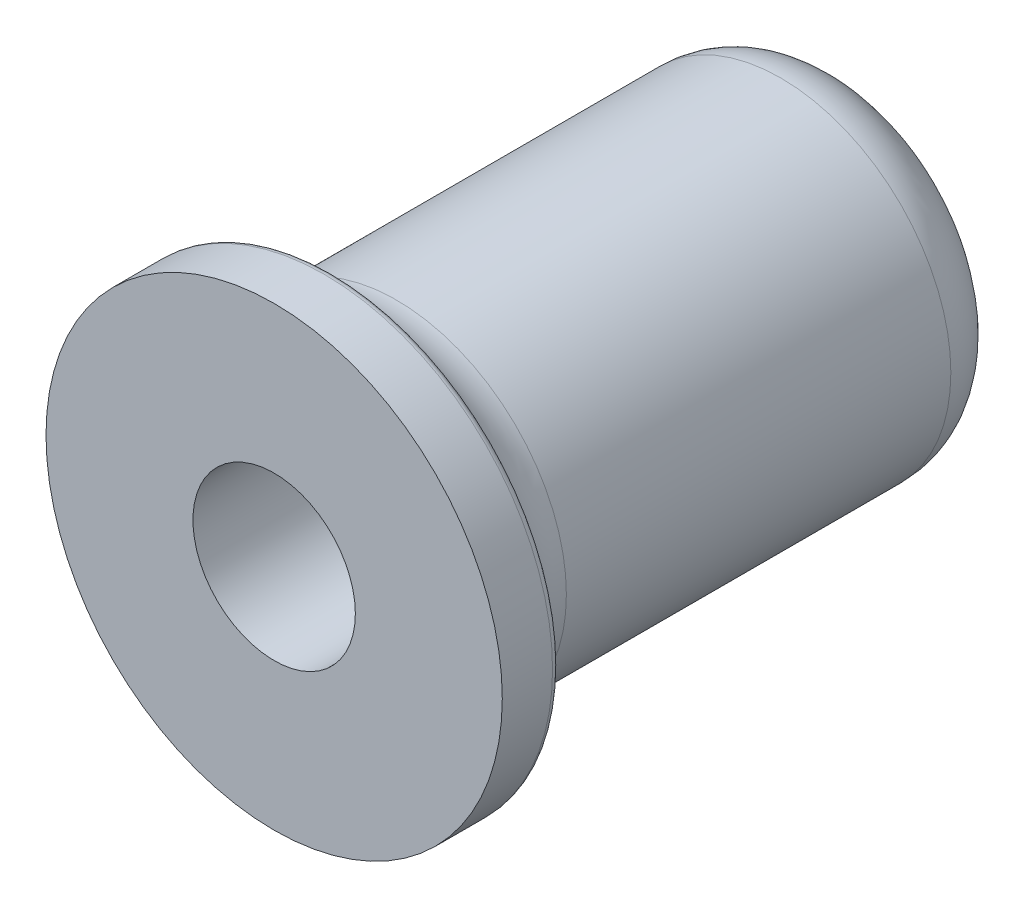
ISO-10303-21;
HEADER;
FILE_DESCRIPTION(('STEP AP214'),'2;1');
FILE_NAME('part.step','',(''),(''),'','','');
FILE_SCHEMA(('AUTOMOTIVE_DESIGN { 1 0 10303 214 1 1 1 1 }'));
ENDSEC;
DATA;
#1=APPLICATION_CONTEXT('core data for automotive mechanical design processes');
#2=APPLICATION_PROTOCOL_DEFINITION('international standard','automotive_design',2000,#1);
#3=PRODUCT_CONTEXT('',#1,'mechanical');
#4=PRODUCT('Part','Part','',(#3));
#5=PRODUCT_RELATED_PRODUCT_CATEGORY('part','',(#4));
#6=PRODUCT_DEFINITION_FORMATION('','',#4);
#7=PRODUCT_DEFINITION_CONTEXT('part definition',#1,'design');
#8=PRODUCT_DEFINITION('design','',#6,#7);
#9=PRODUCT_DEFINITION_SHAPE('','',#8);
#10=(LENGTH_UNIT() NAMED_UNIT(*) SI_UNIT(.MILLI.,.METRE.));
#11=(NAMED_UNIT(*) PLANE_ANGLE_UNIT() SI_UNIT($,.RADIAN.));
#12=(NAMED_UNIT(*) SI_UNIT($,.STERADIAN.) SOLID_ANGLE_UNIT());
#13=UNCERTAINTY_MEASURE_WITH_UNIT(LENGTH_MEASURE(1.E-05),#10,'distance_accuracy_value','');
#14=(GEOMETRIC_REPRESENTATION_CONTEXT(3) GLOBAL_UNCERTAINTY_ASSIGNED_CONTEXT((#13)) GLOBAL_UNIT_ASSIGNED_CONTEXT((#10,
#11,#12)) REPRESENTATION_CONTEXT('',''));
#15=CARTESIAN_POINT('',(0.,0.,0.));
#16=DIRECTION('',(0.,0.,1.));
#17=DIRECTION('',(1.,0.,0.));
#18=AXIS2_PLACEMENT_3D('',#15,#16,#17);
#19=CARTESIAN_POINT('',(0.,0.,0.));
#20=DIRECTION('',(0.,0.,1.));
#21=DIRECTION('',(1.,0.,0.));
#22=AXIS2_PLACEMENT_3D('',#19,#20,#21);
#23=CYLINDRICAL_SURFACE('',#22,5.9);
#24=CARTESIAN_POINT('',(0.,0.,-1.3));
#25=DIRECTION('',(0.,0.,1.));
#26=DIRECTION('',(1.,0.,0.));
#27=AXIS2_PLACEMENT_3D('',#24,#25,#26);
#28=CIRCLE('',#27,5.9);
#29=CARTESIAN_POINT('',(5.9,0.,-1.3));
#30=VERTEX_POINT('',#29);
#31=EDGE_CURVE('E61',#30,#30,#28,.T.);
#32=ORIENTED_EDGE('',*,*,#31,.T.);
#33=EDGE_LOOP('',(#32));
#34=FACE_BOUND('',#33,.T.);
#35=CARTESIAN_POINT('',(0.,0.,0.));
#36=DIRECTION('',(0.,0.,1.));
#37=DIRECTION('',(1.,0.,0.));
#38=AXIS2_PLACEMENT_3D('',#35,#36,#37);
#39=CIRCLE('',#38,5.9);
#40=CARTESIAN_POINT('',(5.9,0.,0.));
#41=VERTEX_POINT('',#40);
#42=EDGE_CURVE('E65',#41,#41,#39,.T.);
#43=ORIENTED_EDGE('',*,*,#42,.F.);
#44=EDGE_LOOP('',(#43));
#45=FACE_BOUND('',#44,.T.);
#46=ADVANCED_FACE('F37',(#34,#45),#23,.T.);
#47=CARTESIAN_POINT('',(0.,0.,0.));
#48=DIRECTION('',(0.,0.,1.));
#49=DIRECTION('',(1.,0.,0.));
#50=AXIS2_PLACEMENT_3D('',#47,#48,#49);
#51=PLANE('',#50);
#52=CARTESIAN_POINT('',(0.,0.,0.));
#53=DIRECTION('',(0.,0.,1.));
#54=DIRECTION('',(1.,0.,0.));
#55=AXIS2_PLACEMENT_3D('',#52,#53,#54);
#56=CIRCLE('',#55,2.1);
#57=CARTESIAN_POINT('',(2.1,0.,0.));
#58=VERTEX_POINT('',#57);
#59=EDGE_CURVE('E70',#58,#58,#56,.T.);
#60=ORIENTED_EDGE('',*,*,#59,.F.);
#61=EDGE_LOOP('',(#60));
#62=FACE_BOUND('',#61,.T.);
#63=ORIENTED_EDGE('',*,*,#42,.T.);
#64=EDGE_LOOP('',(#63));
#65=FACE_BOUND('',#64,.T.);
#66=ADVANCED_FACE('F83',(#62,#65),#51,.T.);
#67=CARTESIAN_POINT('',(0.,0.,-13.));
#68=DIRECTION('',(0.,0.,1.));
#69=DIRECTION('',(1.,0.,0.));
#70=AXIS2_PLACEMENT_3D('',#67,#68,#69);
#71=CYLINDRICAL_SURFACE('',#70,2.1);
#72=CARTESIAN_POINT('',(0.,0.,-13.));
#73=DIRECTION('',(0.,0.,1.));
#74=DIRECTION('',(1.,0.,0.));
#75=AXIS2_PLACEMENT_3D('',#72,#73,#74);
#76=CIRCLE('',#75,2.1);
#77=CARTESIAN_POINT('',(2.1,0.,-13.));
#78=VERTEX_POINT('',#77);
#79=EDGE_CURVE('E69',#78,#78,#76,.T.);
#80=CARTESIAN_POINT('',(2.1,0.,-13.));
#81=CARTESIAN_POINT('',(2.1,0.,-12.8645833333333));
#82=CARTESIAN_POINT('',(2.1,0.,-12.7291666666667));
#83=CARTESIAN_POINT('',(2.1,0.,-12.4583333333333));
#84=CARTESIAN_POINT('',(2.1,0.,-12.3229166666667));
#85=CARTESIAN_POINT('',(2.1,0.,-12.0520833333333));
#86=CARTESIAN_POINT('',(2.1,0.,-11.9166666666667));
#87=CARTESIAN_POINT('',(2.1,0.,-11.6458333333333));
#88=CARTESIAN_POINT('',(2.1,0.,-11.5104166666667));
#89=CARTESIAN_POINT('',(2.1,0.,-11.2395833333333));
#90=CARTESIAN_POINT('',(2.1,0.,-11.1041666666667));
#91=CARTESIAN_POINT('',(2.1,0.,-10.8333333333333));
#92=CARTESIAN_POINT('',(2.1,0.,-10.6979166666667));
#93=CARTESIAN_POINT('',(2.1,0.,-10.4270833333333));
#94=CARTESIAN_POINT('',(2.1,0.,-10.2916666666667));
#95=CARTESIAN_POINT('',(2.1,0.,-10.0208333333333));
#96=CARTESIAN_POINT('',(2.1,0.,-9.88541666666667));
#97=CARTESIAN_POINT('',(2.1,0.,-9.61458333333333));
#98=CARTESIAN_POINT('',(2.1,0.,-9.47916666666667));
#99=CARTESIAN_POINT('',(2.1,0.,-9.20833333333333));
#100=CARTESIAN_POINT('',(2.1,0.,-9.07291666666667));
#101=CARTESIAN_POINT('',(2.1,0.,-8.80208333333333));
#102=CARTESIAN_POINT('',(2.1,0.,-8.66666666666667));
#103=CARTESIAN_POINT('',(2.1,0.,-8.39583333333333));
#104=CARTESIAN_POINT('',(2.1,0.,-8.26041666666667));
#105=CARTESIAN_POINT('',(2.1,0.,-7.98958333333333));
#106=CARTESIAN_POINT('',(2.1,0.,-7.85416666666667));
#107=CARTESIAN_POINT('',(2.1,0.,-7.58333333333333));
#108=CARTESIAN_POINT('',(2.1,0.,-7.44791666666667));
#109=CARTESIAN_POINT('',(2.1,0.,-7.17708333333333));
#110=CARTESIAN_POINT('',(2.1,0.,-7.04166666666667));
#111=CARTESIAN_POINT('',(2.1,0.,-6.77083333333333));
#112=CARTESIAN_POINT('',(2.1,0.,-6.63541666666667));
#113=CARTESIAN_POINT('',(2.1,0.,-6.36458333333333));
#114=CARTESIAN_POINT('',(2.1,0.,-6.22916666666667));
#115=CARTESIAN_POINT('',(2.1,0.,-5.95833333333333));
#116=CARTESIAN_POINT('',(2.1,0.,-5.82291666666667));
#117=CARTESIAN_POINT('',(2.1,0.,-5.55208333333333));
#118=CARTESIAN_POINT('',(2.1,0.,-5.41666666666667));
#119=CARTESIAN_POINT('',(2.1,0.,-5.14583333333333));
#120=CARTESIAN_POINT('',(2.1,0.,-5.01041666666667));
#121=CARTESIAN_POINT('',(2.1,0.,-4.73958333333333));
#122=CARTESIAN_POINT('',(2.1,0.,-4.60416666666667));
#123=CARTESIAN_POINT('',(2.1,0.,-4.33333333333333));
#124=CARTESIAN_POINT('',(2.1,0.,-4.19791666666667));
#125=CARTESIAN_POINT('',(2.1,0.,-3.92708333333333));
#126=CARTESIAN_POINT('',(2.1,0.,-3.79166666666667));
#127=CARTESIAN_POINT('',(2.1,0.,-3.52083333333333));
#128=CARTESIAN_POINT('',(2.1,0.,-3.38541666666667));
#129=CARTESIAN_POINT('',(2.1,0.,-3.11458333333333));
#130=CARTESIAN_POINT('',(2.1,0.,-2.97916666666667));
#131=CARTESIAN_POINT('',(2.1,0.,-2.70833333333333));
#132=CARTESIAN_POINT('',(2.1,0.,-2.57291666666667));
#133=CARTESIAN_POINT('',(2.1,0.,-2.30208333333333));
#134=CARTESIAN_POINT('',(2.1,0.,-2.16666666666667));
#135=CARTESIAN_POINT('',(2.1,0.,-1.89583333333333));
#136=CARTESIAN_POINT('',(2.1,0.,-1.76041666666667));
#137=CARTESIAN_POINT('',(2.1,0.,-1.48958333333333));
#138=CARTESIAN_POINT('',(2.1,0.,-1.35416666666667));
#139=CARTESIAN_POINT('',(2.1,0.,-1.08333333333333));
#140=CARTESIAN_POINT('',(2.1,0.,-0.947916666666667));
#141=CARTESIAN_POINT('',(2.1,0.,-0.677083333333334));
#142=CARTESIAN_POINT('',(2.1,0.,-0.541666666666667));
#143=CARTESIAN_POINT('',(2.1,0.,-0.270833333333334));
#144=CARTESIAN_POINT('',(2.1,0.,-0.135416666666667));
#145=CARTESIAN_POINT('',(2.1,0.,0.));
#146=B_SPLINE_CURVE_WITH_KNOTS('',3,(#80,#81,#82,#83,#84,#85,#86,#87,#88,#89,#90,#91,#92,#93,
#94,#95,#96,#97,#98,#99,#100,#101,#102,#103,#104,#105,#106,#107,#108,#109,#110,#111,#112,#113,
#114,#115,#116,#117,#118,#119,#120,#121,#122,#123,#124,#125,#126,#127,#128,#129,#130,#131,#132,
#133,#134,#135,#136,#137,#138,#139,#140,#141,#142,#143,#144,#145),.UNSPECIFIED.,.F.,.F.,(4,2,2,
2,2,2,2,2,2,2,2,2,2,2,2,2,2,2,2,2,2,2,2,2,2,2,2,2,2,2,2,2,4),(0.,0.40625,0.812500000000001,
1.21875,1.625,2.03125,2.4375,2.84375,3.25,3.65625,4.0625,4.46875,4.875,5.28125,5.6875,6.09375,
6.5,6.90625,7.3125,7.71875,8.125,8.53125,8.9375,9.34375,9.75,10.15625,10.5625,10.96875,11.375,
11.78125,12.1875,12.59375,13.),.UNSPECIFIED.);
#147=EDGE_CURVE('BSEAM80',#78,#58,#146,.T.);
#148=ORIENTED_EDGE('',*,*,#79,.F.);
#149=ORIENTED_EDGE('',*,*,#59,.T.);
#150=ORIENTED_EDGE('',*,*,#147,.T.);
#151=ORIENTED_EDGE('',*,*,#147,.F.);
#152=EDGE_LOOP('',(#148,#150,#149,#151));
#153=FACE_BOUND('',#152,.T.);
#154=ADVANCED_FACE('F80',(#153),#71,.F.);
#155=CARTESIAN_POINT('',(0.,0.,-13.));
#156=DIRECTION('',(0.,0.,1.));
#157=DIRECTION('',(1.,0.,0.));
#158=AXIS2_PLACEMENT_3D('',#155,#156,#157);
#159=PLANE('',#158);
#160=ORIENTED_EDGE('',*,*,#79,.T.);
#161=EDGE_LOOP('',(#160));
#162=FACE_BOUND('',#161,.T.);
#163=ADVANCED_FACE('F78',(#162),#159,.T.);
#164=CARTESIAN_POINT('',(0.,0.,-1.5));
#165=DIRECTION('',(0.,0.,1.));
#166=DIRECTION('',(1.,0.,0.));
#167=AXIS2_PLACEMENT_3D('',#164,#165,#166);
#168=CYLINDRICAL_SURFACE('',#167,4.4);
#169=CARTESIAN_POINT('',(0.,0.,-3.15741756210067));
#170=DIRECTION('',(0.,0.,1.));
#171=DIRECTION('',(1.,0.,0.));
#172=AXIS2_PLACEMENT_3D('',#169,#170,#171);
#173=CIRCLE('',#172,4.4);
#174=CARTESIAN_POINT('',(4.4,0.,-3.15741756210067));
#175=VERTEX_POINT('',#174);
#176=EDGE_CURVE('E10',#175,#175,#173,.F.);
#177=ORIENTED_EDGE('',*,*,#176,.T.);
#178=EDGE_LOOP('',(#177));
#179=FACE_BOUND('',#178,.T.);
#180=CARTESIAN_POINT('',(0.,0.,-13.1));
#181=DIRECTION('',(0.,0.,-1.));
#182=DIRECTION('',(-1.,0.,0.));
#183=AXIS2_PLACEMENT_3D('',#180,#181,#182);
#184=CIRCLE('',#183,4.4);
#185=CARTESIAN_POINT('',(-4.4,0.,-13.1));
#186=VERTEX_POINT('',#185);
#187=EDGE_CURVE('E55',#186,#186,#184,.F.);
#188=ORIENTED_EDGE('',*,*,#187,.T.);
#189=EDGE_LOOP('',(#188));
#190=FACE_BOUND('',#189,.T.);
#191=ADVANCED_FACE('F102',(#179,#190),#168,.T.);
#192=CARTESIAN_POINT('',(0.,0.,-14.8));
#193=DIRECTION('',(0.,0.,-1.));
#194=DIRECTION('',(-1.,0.,0.));
#195=AXIS2_PLACEMENT_3D('',#192,#193,#194);
#196=PLANE('',#195);
#197=CARTESIAN_POINT('',(0.,0.,-14.8));
#198=DIRECTION('',(0.,0.,-1.));
#199=DIRECTION('',(-1.,0.,0.));
#200=AXIS2_PLACEMENT_3D('',#197,#198,#199);
#201=CIRCLE('',#200,2.7);
#202=CARTESIAN_POINT('',(-2.7,0.,-14.8));
#203=VERTEX_POINT('',#202);
#204=EDGE_CURVE('E50',#203,#203,#201,.T.);
#205=ORIENTED_EDGE('',*,*,#204,.T.);
#206=EDGE_LOOP('',(#205));
#207=FACE_BOUND('',#206,.T.);
#208=ADVANCED_FACE('F98',(#207),#196,.T.);
#209=CARTESIAN_POINT('',(0.,0.,-1.3));
#210=DIRECTION('',(0.,0.,1.));
#211=DIRECTION('',(1.,0.,0.));
#212=AXIS2_PLACEMENT_3D('',#209,#210,#211);
#213=TOROIDAL_SURFACE('',#212,5.7,0.2);
#214=CARTESIAN_POINT('',(0.,0.,-1.4955176381149));
#215=DIRECTION('',(0.,0.,1.));
#216=DIRECTION('',(1.,0.,0.));
#217=AXIS2_PLACEMENT_3D('',#214,#215,#216);
#218=CIRCLE('',#217,5.74210526315769);
#219=CARTESIAN_POINT('',(5.74210526315769,0.,-1.4955176381149));
#220=VERTEX_POINT('',#219);
#221=EDGE_CURVE('E45',#220,#220,#218,.T.);
#222=ORIENTED_EDGE('',*,*,#221,.T.);
#223=EDGE_LOOP('',(#222));
#224=FACE_BOUND('',#223,.T.);
#225=ORIENTED_EDGE('',*,*,#31,.F.);
#226=EDGE_LOOP('',(#225));
#227=FACE_BOUND('',#226,.T.);
#228=ADVANCED_FACE('F101',(#224,#227),#213,.T.);
#229=CARTESIAN_POINT('',(0.,0.,-13.1));
#230=DIRECTION('',(0.,0.,-1.));
#231=DIRECTION('',(-1.,0.,0.));
#232=AXIS2_PLACEMENT_3D('',#229,#230,#231);
#233=TOROIDAL_SURFACE('',#232,2.7,1.7);
#234=ORIENTED_EDGE('',*,*,#204,.F.);
#235=EDGE_LOOP('',(#234));
#236=FACE_BOUND('',#235,.T.);
#237=ORIENTED_EDGE('',*,*,#187,.F.);
#238=EDGE_LOOP('',(#237));
#239=FACE_BOUND('',#238,.T.);
#240=ADVANCED_FACE('F105',(#236,#239),#233,.T.);
#241=CARTESIAN_POINT('',(0.,0.,-3.15741756210067));
#242=DIRECTION('',(0.,0.,1.));
#243=DIRECTION('',(1.,0.,0.));
#244=AXIS2_PLACEMENT_3D('',#241,#242,#243);
#245=TOROIDAL_SURFACE('',#244,6.1,1.7);
#246=ORIENTED_EDGE('',*,*,#176,.F.);
#247=EDGE_LOOP('',(#246));
#248=FACE_BOUND('',#247,.T.);
#249=ORIENTED_EDGE('',*,*,#221,.F.);
#250=EDGE_LOOP('',(#249));
#251=FACE_BOUND('',#250,.T.);
#252=ADVANCED_FACE('F39',(#248,#251),#245,.F.);
#253=CLOSED_SHELL('',(#46,#66,#154,#163,#191,#208,#228,#240,#252));
#254=MANIFOLD_SOLID_BREP('B2',#253);
#255=ADVANCED_BREP_SHAPE_REPRESENTATION('',(#18,#254),#14);
#256=SHAPE_DEFINITION_REPRESENTATION(#9,#255);
ENDSEC;
END-ISO-10303-21;
